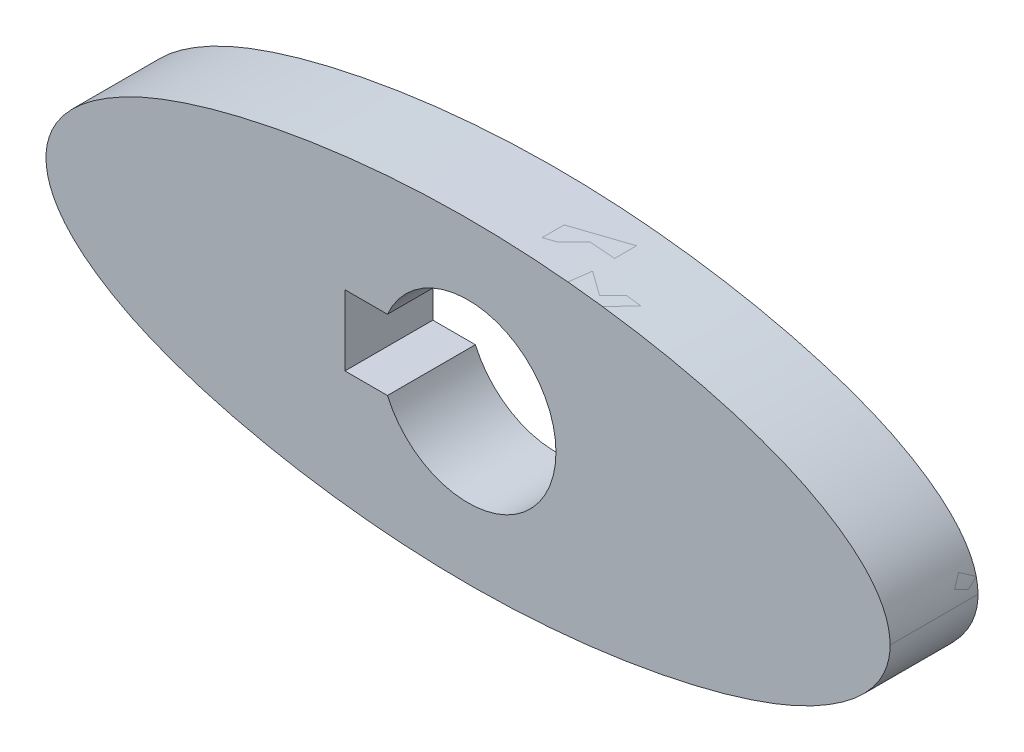
ISO-10303-21;
HEADER;
FILE_DESCRIPTION(('STEP AP214'),'2;1');
FILE_NAME('part.step','',(''),(''),'','','');
FILE_SCHEMA(('AUTOMOTIVE_DESIGN { 1 0 10303 214 1 1 1 1 }'));
ENDSEC;
DATA;
#1=APPLICATION_CONTEXT('core data for automotive mechanical design processes');
#2=APPLICATION_PROTOCOL_DEFINITION('international standard','automotive_design',2000,#1);
#3=PRODUCT_CONTEXT('',#1,'mechanical');
#4=PRODUCT('Part','Part','',(#3));
#5=PRODUCT_RELATED_PRODUCT_CATEGORY('part','',(#4));
#6=PRODUCT_DEFINITION_FORMATION('','',#4);
#7=PRODUCT_DEFINITION_CONTEXT('part definition',#1,'design');
#8=PRODUCT_DEFINITION('design','',#6,#7);
#9=PRODUCT_DEFINITION_SHAPE('','',#8);
#10=(LENGTH_UNIT() NAMED_UNIT(*) SI_UNIT(.MILLI.,.METRE.));
#11=(NAMED_UNIT(*) PLANE_ANGLE_UNIT() SI_UNIT($,.RADIAN.));
#12=(NAMED_UNIT(*) SI_UNIT($,.STERADIAN.) SOLID_ANGLE_UNIT());
#13=UNCERTAINTY_MEASURE_WITH_UNIT(LENGTH_MEASURE(1.E-05),#10,'distance_accuracy_value','');
#14=(GEOMETRIC_REPRESENTATION_CONTEXT(3) GLOBAL_UNCERTAINTY_ASSIGNED_CONTEXT((#13)) GLOBAL_UNIT_ASSIGNED_CONTEXT((#10,
#11,#12)) REPRESENTATION_CONTEXT('',''));
#15=CARTESIAN_POINT('',(0.,0.,0.));
#16=DIRECTION('',(0.,0.,1.));
#17=DIRECTION('',(1.,0.,0.));
#18=AXIS2_PLACEMENT_3D('',#15,#16,#17);
#19=CARTESIAN_POINT('',(29.937276524645,-5.83163265306122,5.));
#20=CARTESIAN_POINT('',(29.9372765246455,-4.33163265306129,5.));
#21=CARTESIAN_POINT('',(28.9772765246454,-2.35163265306127,5.));
#22=CARTESIAN_POINT('',(21.2972765246454,1.48836734693878,5.));
#23=CARTESIAN_POINT('',(13.9372765246452,3.16836734693884,5.));
#24=CARTESIAN_POINT('',(-2.06272347535506,3.16836734693884,5.));
#25=CARTESIAN_POINT('',(-9.42272347535525,1.4883673469388,5.));
#26=CARTESIAN_POINT('',(-17.1027234753555,-2.35163265306127,5.));
#27=CARTESIAN_POINT('',(-18.0627234753554,-4.3316326530613,5.));
#28=CARTESIAN_POINT('',(-18.062723475355,-5.83163265306122,5.));
#29=B_SPLINE_CURVE_WITH_KNOTS('',3,(#19,#20,#21,#22,#23,#24,#25,#26,#27,#28),.UNSPECIFIED.,.F.,
.F.,(4,2,2,2,4),(0.,0.25,0.5,0.75,1.),.UNSPECIFIED.);
#30=DIRECTION('',(0.,0.,-1.));
#31=VECTOR('',#30,1.);
#32=SURFACE_OF_LINEAR_EXTRUSION('',#29,#31);
#33=CARTESIAN_POINT('',(29.937276524645,-5.83163265306122,0.));
#34=CARTESIAN_POINT('',(29.9372765246455,-4.33163265306129,0.));
#35=CARTESIAN_POINT('',(28.9772765246454,-2.35163265306127,0.));
#36=CARTESIAN_POINT('',(21.2972765246454,1.48836734693878,0.));
#37=CARTESIAN_POINT('',(13.9372765246452,3.16836734693884,0.));
#38=CARTESIAN_POINT('',(-2.06272347535506,3.16836734693884,0.));
#39=CARTESIAN_POINT('',(-9.42272347535525,1.4883673469388,0.));
#40=CARTESIAN_POINT('',(-17.1027234753555,-2.35163265306127,0.));
#41=CARTESIAN_POINT('',(-18.0627234753554,-4.3316326530613,0.));
#42=CARTESIAN_POINT('',(-18.062723475355,-5.83163265306122,0.));
#43=B_SPLINE_CURVE_WITH_KNOTS('',3,(#33,#34,#35,#36,#37,#38,#39,#40,#41,#42),.UNSPECIFIED.,.F.,
.F.,(4,2,2,2,4),(0.,0.25,0.5,0.75,1.),.UNSPECIFIED.);
#44=CARTESIAN_POINT('',(29.937276524645,-5.83163265306122,0.));
#45=VERTEX_POINT('',#44);
#46=CARTESIAN_POINT('',(-18.062723475355,-5.83163265306122,0.));
#47=VERTEX_POINT('',#46);
#48=EDGE_CURVE('E54',#45,#47,#43,.T.);
#49=ORIENTED_EDGE('',*,*,#48,.F.);
#50=DIRECTION('',(0.,0.,-1.));
#51=VECTOR('',#50,1.);
#52=CARTESIAN_POINT('',(29.937276524645,-5.83163265306122,5.));
#53=LINE('',#52,#51);
#54=CARTESIAN_POINT('',(29.937276524645,-5.83163265306122,5.));
#55=VERTEX_POINT('',#54);
#56=EDGE_CURVE('E61',#55,#45,#53,.T.);
#57=ORIENTED_EDGE('',*,*,#56,.F.);
#58=CARTESIAN_POINT('',(-18.062723475355,-5.83163265306122,5.));
#59=VERTEX_POINT('',#58);
#60=EDGE_CURVE('E12',#55,#59,#29,.T.);
#61=ORIENTED_EDGE('',*,*,#60,.T.);
#62=DIRECTION('',(0.,0.,-1.));
#63=VECTOR('',#62,1.);
#64=CARTESIAN_POINT('',(-18.062723475355,-5.83163265306122,5.));
#65=LINE('',#64,#63);
#66=EDGE_CURVE('E48',#59,#47,#65,.T.);
#67=ORIENTED_EDGE('',*,*,#66,.T.);
#68=EDGE_LOOP('',(#49,#57,#61,#67));
#69=FACE_BOUND('',#68,.T.);
#70=ADVANCED_FACE('F45',(#69),#32,.T.);
#71=CARTESIAN_POINT('',(-18.062723475355,-5.83163265306122,5.));
#72=CARTESIAN_POINT('',(-18.0627234753554,-7.33163265306135,5.));
#73=CARTESIAN_POINT('',(-17.1027234753554,-9.31163265306139,5.));
#74=CARTESIAN_POINT('',(-9.42272347535519,-13.1516326530615,5.));
#75=CARTESIAN_POINT('',(-2.06272347535508,-14.8316326530615,5.));
#76=CARTESIAN_POINT('',(13.9372765246453,-14.8316326530615,5.));
#77=CARTESIAN_POINT('',(21.2972765246454,-13.1516326530615,5.));
#78=CARTESIAN_POINT('',(28.9772765246455,-9.31163265306142,5.));
#79=CARTESIAN_POINT('',(29.9372765246456,-7.33163265306136,5.));
#80=CARTESIAN_POINT('',(29.937276524645,-5.83163265306122,5.));
#81=B_SPLINE_CURVE_WITH_KNOTS('',3,(#71,#72,#73,#74,#75,#76,#77,#78,#79,#80),.UNSPECIFIED.,.F.,
.F.,(4,2,2,2,4),(0.,0.25,0.5,0.75,1.),.UNSPECIFIED.);
#82=DIRECTION('',(0.,0.,-1.));
#83=VECTOR('',#82,1.);
#84=SURFACE_OF_LINEAR_EXTRUSION('',#81,#83);
#85=CARTESIAN_POINT('',(-18.062723475355,-5.83163265306122,0.));
#86=CARTESIAN_POINT('',(-18.0627234753554,-7.33163265306135,0.));
#87=CARTESIAN_POINT('',(-17.1027234753554,-9.31163265306139,0.));
#88=CARTESIAN_POINT('',(-9.42272347535519,-13.1516326530615,0.));
#89=CARTESIAN_POINT('',(-2.06272347535508,-14.8316326530615,0.));
#90=CARTESIAN_POINT('',(13.9372765246453,-14.8316326530615,0.));
#91=CARTESIAN_POINT('',(21.2972765246454,-13.1516326530615,0.));
#92=CARTESIAN_POINT('',(28.9772765246455,-9.31163265306142,0.));
#93=CARTESIAN_POINT('',(29.9372765246456,-7.33163265306136,0.));
#94=CARTESIAN_POINT('',(29.937276524645,-5.83163265306122,0.));
#95=B_SPLINE_CURVE_WITH_KNOTS('',3,(#85,#86,#87,#88,#89,#90,#91,#92,#93,#94),.UNSPECIFIED.,.F.,
.F.,(4,2,2,2,4),(0.,0.25,0.5,0.75,1.),.UNSPECIFIED.);
#96=EDGE_CURVE('E71',#47,#45,#95,.T.);
#97=ORIENTED_EDGE('',*,*,#96,.F.);
#98=ORIENTED_EDGE('',*,*,#66,.F.);
#99=EDGE_CURVE('E74',#59,#55,#81,.T.);
#100=ORIENTED_EDGE('',*,*,#99,.T.);
#101=ORIENTED_EDGE('',*,*,#56,.T.);
#102=EDGE_LOOP('',(#97,#98,#100,#101));
#103=FACE_BOUND('',#102,.T.);
#104=ADVANCED_FACE('F70',(#103),#84,.T.);
#105=OPEN_SHELL('',(#70,#104));
#106=SHELL_BASED_SURFACE_MODEL('B2',(#105));
#107=CARTESIAN_POINT('',(5.93727652464509,-14.8316326530615,5.));
#108=DIRECTION('',(0.,0.,-1.));
#109=DIRECTION('',(-1.,0.,0.));
#110=AXIS2_PLACEMENT_3D('',#107,#108,#109);
#111=PLANE('',#110);
#112=CARTESIAN_POINT('',(-18.062723475355,-5.83163265306122,5.));
#113=CARTESIAN_POINT('',(-18.0627234753554,-7.33163265306135,5.));
#114=CARTESIAN_POINT('',(-17.1027234753554,-9.31163265306139,5.));
#115=CARTESIAN_POINT('',(-9.42272347535519,-13.1516326530615,5.));
#116=CARTESIAN_POINT('',(-2.06272347535508,-14.8316326530615,5.));
#117=CARTESIAN_POINT('',(13.9372765246453,-14.8316326530615,5.));
#118=CARTESIAN_POINT('',(21.2972765246454,-13.1516326530615,5.));
#119=CARTESIAN_POINT('',(28.9772765246455,-9.31163265306142,5.));
#120=CARTESIAN_POINT('',(29.9372765246456,-7.33163265306136,5.));
#121=CARTESIAN_POINT('',(29.937276524645,-5.83163265306122,5.));
#122=B_SPLINE_CURVE_WITH_KNOTS('',3,(#112,#113,#114,#115,#116,#117,#118,#119,#120,#121),
.UNSPECIFIED.,.F.,.F.,(4,2,2,2,4),(0.,0.25,0.5,0.75,1.),.UNSPECIFIED.);
#123=CARTESIAN_POINT('',(-18.062723475355,-5.83163265306122,5.));
#124=VERTEX_POINT('',#123);
#125=CARTESIAN_POINT('',(29.937276524645,-5.83163265306122,5.));
#126=VERTEX_POINT('',#125);
#127=EDGE_CURVE('E217',#124,#126,#122,.T.);
#128=ORIENTED_EDGE('',*,*,#127,.T.);
#129=CARTESIAN_POINT('',(29.937276524645,-5.83163265306122,5.));
#130=CARTESIAN_POINT('',(29.9372765246455,-4.33163265306129,5.));
#131=CARTESIAN_POINT('',(28.9772765246454,-2.35163265306127,5.));
#132=CARTESIAN_POINT('',(21.2972765246454,1.48836734693878,5.));
#133=CARTESIAN_POINT('',(13.9372765246452,3.16836734693884,5.));
#134=CARTESIAN_POINT('',(-2.06272347535506,3.16836734693884,5.));
#135=CARTESIAN_POINT('',(-9.42272347535525,1.4883673469388,5.));
#136=CARTESIAN_POINT('',(-17.1027234753555,-2.35163265306127,5.));
#137=CARTESIAN_POINT('',(-18.0627234753554,-4.3316326530613,5.));
#138=CARTESIAN_POINT('',(-18.062723475355,-5.83163265306122,5.));
#139=B_SPLINE_CURVE_WITH_KNOTS('',3,(#129,#130,#131,#132,#133,#134,#135,#136,#137,#138),
.UNSPECIFIED.,.F.,.F.,(4,2,2,2,4),(0.,0.25,0.5,0.75,1.),.UNSPECIFIED.);
#140=EDGE_CURVE('E223',#126,#124,#139,.T.);
#141=ORIENTED_EDGE('',*,*,#140,.T.);
#142=EDGE_LOOP('',(#128,#141));
#143=FACE_BOUND('',#142,.T.);
#144=CARTESIAN_POINT('',(5.93727652464496,-5.83163265306122,5.));
#145=DIRECTION('',(0.,0.,1.));
#146=DIRECTION('',(-1.,0.,0.));
#147=AXIS2_PLACEMENT_3D('',#144,#145,#146);
#148=CIRCLE('',#147,5.);
#149=CARTESIAN_POINT('',(1.35470082968912,-7.83163265306122,5.));
#150=VERTEX_POINT('',#149);
#151=CARTESIAN_POINT('',(1.35470082968912,-3.83163265306122,5.));
#152=VERTEX_POINT('',#151);
#153=EDGE_CURVE('E182',#150,#152,#148,.T.);
#154=ORIENTED_EDGE('',*,*,#153,.F.);
#155=DIRECTION('',(1.,0.,0.));
#156=VECTOR('',#155,1.);
#157=CARTESIAN_POINT('',(-1.06272347535504,-7.83163265306122,5.));
#158=LINE('',#157,#156);
#159=CARTESIAN_POINT('',(-1.06272347535504,-7.83163265306122,5.));
#160=VERTEX_POINT('',#159);
#161=EDGE_CURVE('E204',#160,#150,#158,.T.);
#162=ORIENTED_EDGE('',*,*,#161,.F.);
#163=DIRECTION('',(0.,-1.,0.));
#164=VECTOR('',#163,1.);
#165=CARTESIAN_POINT('',(-1.06272347535504,-3.83163265306122,5.));
#166=LINE('',#165,#164);
#167=CARTESIAN_POINT('',(-1.06272347535504,-3.83163265306122,5.));
#168=VERTEX_POINT('',#167);
#169=EDGE_CURVE('E202',#168,#160,#166,.T.);
#170=ORIENTED_EDGE('',*,*,#169,.F.);
#171=DIRECTION('',(-1.,0.,0.));
#172=VECTOR('',#171,1.);
#173=CARTESIAN_POINT('',(-1.06272347535504,-3.83163265306122,5.));
#174=LINE('',#173,#172);
#175=EDGE_CURVE('E190',#152,#168,#174,.T.);
#176=ORIENTED_EDGE('',*,*,#175,.F.);
#177=EDGE_LOOP('',(#154,#162,#170,#176));
#178=FACE_BOUND('',#177,.T.);
#179=ADVANCED_FACE('F128',(#143,#178),#111,.F.);
#180=CARTESIAN_POINT('',(5.93727652464509,-14.8316326530615,0.));
#181=DIRECTION('',(0.,0.,-1.));
#182=DIRECTION('',(-1.,0.,0.));
#183=AXIS2_PLACEMENT_3D('',#180,#181,#182);
#184=PLANE('',#183);
#185=CARTESIAN_POINT('',(-18.062723475355,-5.83163265306122,0.));
#186=CARTESIAN_POINT('',(-18.0627234753554,-7.33163265306135,0.));
#187=CARTESIAN_POINT('',(-17.1027234753554,-9.31163265306139,0.));
#188=CARTESIAN_POINT('',(-9.42272347535519,-13.1516326530615,0.));
#189=CARTESIAN_POINT('',(-2.06272347535508,-14.8316326530615,0.));
#190=CARTESIAN_POINT('',(13.9372765246453,-14.8316326530615,0.));
#191=CARTESIAN_POINT('',(21.2972765246454,-13.1516326530615,0.));
#192=CARTESIAN_POINT('',(28.9772765246455,-9.31163265306142,0.));
#193=CARTESIAN_POINT('',(29.9372765246456,-7.33163265306136,0.));
#194=CARTESIAN_POINT('',(29.937276524645,-5.83163265306122,0.));
#195=B_SPLINE_CURVE_WITH_KNOTS('',3,(#185,#186,#187,#188,#189,#190,#191,#192,#193,#194),
.UNSPECIFIED.,.F.,.F.,(4,2,2,2,4),(0.,0.25,0.5,0.75,1.),.UNSPECIFIED.);
#196=CARTESIAN_POINT('',(-18.062723475355,-5.83163265306122,0.));
#197=VERTEX_POINT('',#196);
#198=CARTESIAN_POINT('',(29.937276524645,-5.83163265306122,0.));
#199=VERTEX_POINT('',#198);
#200=EDGE_CURVE('E198',#197,#199,#195,.T.);
#201=ORIENTED_EDGE('',*,*,#200,.F.);
#202=CARTESIAN_POINT('',(29.937276524645,-5.83163265306122,0.));
#203=CARTESIAN_POINT('',(29.9372765246455,-4.33163265306129,0.));
#204=CARTESIAN_POINT('',(28.9772765246454,-2.35163265306127,0.));
#205=CARTESIAN_POINT('',(21.2972765246454,1.48836734693878,0.));
#206=CARTESIAN_POINT('',(13.9372765246452,3.16836734693884,0.));
#207=CARTESIAN_POINT('',(-2.06272347535506,3.16836734693884,0.));
#208=CARTESIAN_POINT('',(-9.42272347535525,1.4883673469388,0.));
#209=CARTESIAN_POINT('',(-17.1027234753555,-2.35163265306127,0.));
#210=CARTESIAN_POINT('',(-18.0627234753554,-4.3316326530613,0.));
#211=CARTESIAN_POINT('',(-18.062723475355,-5.83163265306122,0.));
#212=B_SPLINE_CURVE_WITH_KNOTS('',3,(#202,#203,#204,#205,#206,#207,#208,#209,#210,#211),
.UNSPECIFIED.,.F.,.F.,(4,2,2,2,4),(0.,0.25,0.5,0.75,1.),.UNSPECIFIED.);
#213=EDGE_CURVE('E224',#199,#197,#212,.T.);
#214=ORIENTED_EDGE('',*,*,#213,.F.);
#215=EDGE_LOOP('',(#201,#214));
#216=FACE_BOUND('',#215,.T.);
#217=DIRECTION('',(1.,0.,0.));
#218=VECTOR('',#217,1.);
#219=CARTESIAN_POINT('',(-1.06272347535504,-7.83163265306122,0.));
#220=LINE('',#219,#218);
#221=CARTESIAN_POINT('',(-1.06272347535504,-7.83163265306122,0.));
#222=VERTEX_POINT('',#221);
#223=CARTESIAN_POINT('',(1.35470082968912,-7.83163265306122,0.));
#224=VERTEX_POINT('',#223);
#225=EDGE_CURVE('E191',#222,#224,#220,.T.);
#226=ORIENTED_EDGE('',*,*,#225,.T.);
#227=CARTESIAN_POINT('',(5.93727652464496,-5.83163265306122,0.));
#228=DIRECTION('',(0.,0.,1.));
#229=DIRECTION('',(-1.,0.,0.));
#230=AXIS2_PLACEMENT_3D('',#227,#228,#229);
#231=CIRCLE('',#230,5.);
#232=CARTESIAN_POINT('',(1.35470082968912,-3.83163265306122,0.));
#233=VERTEX_POINT('',#232);
#234=EDGE_CURVE('E152',#224,#233,#231,.T.);
#235=ORIENTED_EDGE('',*,*,#234,.T.);
#236=DIRECTION('',(-1.,0.,0.));
#237=VECTOR('',#236,1.);
#238=CARTESIAN_POINT('',(-1.06272347535504,-3.83163265306122,0.));
#239=LINE('',#238,#237);
#240=CARTESIAN_POINT('',(-1.06272347535504,-3.83163265306122,0.));
#241=VERTEX_POINT('',#240);
#242=EDGE_CURVE('E197',#233,#241,#239,.T.);
#243=ORIENTED_EDGE('',*,*,#242,.T.);
#244=DIRECTION('',(0.,-1.,0.));
#245=VECTOR('',#244,1.);
#246=CARTESIAN_POINT('',(-1.06272347535504,-3.83163265306122,0.));
#247=LINE('',#246,#245);
#248=EDGE_CURVE('E210',#241,#222,#247,.T.);
#249=ORIENTED_EDGE('',*,*,#248,.T.);
#250=EDGE_LOOP('',(#226,#235,#243,#249));
#251=FACE_BOUND('',#250,.T.);
#252=ADVANCED_FACE('F242',(#216,#251),#184,.T.);
#253=DIRECTION('',(0.,0.,-1.));
#254=VECTOR('',#253,1.);
#255=SURFACE_OF_LINEAR_EXTRUSION('',#122,#254);
#256=ORIENTED_EDGE('',*,*,#200,.T.);
#257=DIRECTION('',(0.,0.,-1.));
#258=VECTOR('',#257,1.);
#259=CARTESIAN_POINT('',(29.937276524645,-5.83163265306122,5.));
#260=LINE('',#259,#258);
#261=EDGE_CURVE('E43',#126,#199,#260,.T.);
#262=ORIENTED_EDGE('',*,*,#261,.F.);
#263=ORIENTED_EDGE('',*,*,#127,.F.);
#264=DIRECTION('',(0.,0.,-1.));
#265=VECTOR('',#264,1.);
#266=CARTESIAN_POINT('',(-18.062723475355,-5.83163265306122,5.));
#267=LINE('',#266,#265);
#268=EDGE_CURVE('E137',#124,#197,#267,.T.);
#269=ORIENTED_EDGE('',*,*,#268,.T.);
#270=EDGE_LOOP('',(#256,#262,#263,#269));
#271=FACE_BOUND('',#270,.T.);
#272=ADVANCED_FACE('F130',(#271),#255,.F.);
#273=DIRECTION('',(0.,0.,-1.));
#274=VECTOR('',#273,1.);
#275=SURFACE_OF_LINEAR_EXTRUSION('',#139,#274);
#276=ORIENTED_EDGE('',*,*,#213,.T.);
#277=ORIENTED_EDGE('',*,*,#268,.F.);
#278=ORIENTED_EDGE('',*,*,#140,.F.);
#279=ORIENTED_EDGE('',*,*,#261,.T.);
#280=EDGE_LOOP('',(#276,#277,#278,#279));
#281=FACE_BOUND('',#280,.T.);
#282=ADVANCED_FACE('F238',(#281),#275,.F.);
#283=CARTESIAN_POINT('',(5.93727652464496,-5.83163265306122,5.));
#284=DIRECTION('',(0.,0.,-1.));
#285=DIRECTION('',(-1.,0.,0.));
#286=AXIS2_PLACEMENT_3D('',#283,#284,#285);
#287=CYLINDRICAL_SURFACE('',#286,5.);
#288=ORIENTED_EDGE('',*,*,#234,.F.);
#289=DIRECTION('',(0.,0.,-1.));
#290=VECTOR('',#289,1.);
#291=CARTESIAN_POINT('',(1.35470082968912,-7.83163265306122,5.));
#292=LINE('',#291,#290);
#293=EDGE_CURVE('E186',#150,#224,#292,.T.);
#294=ORIENTED_EDGE('',*,*,#293,.F.);
#295=ORIENTED_EDGE('',*,*,#153,.T.);
#296=DIRECTION('',(0.,0.,-1.));
#297=VECTOR('',#296,1.);
#298=CARTESIAN_POINT('',(1.35470082968912,-3.83163265306122,5.));
#299=LINE('',#298,#297);
#300=EDGE_CURVE('E185',#152,#233,#299,.T.);
#301=ORIENTED_EDGE('',*,*,#300,.T.);
#302=EDGE_LOOP('',(#288,#294,#295,#301));
#303=FACE_BOUND('',#302,.T.);
#304=ADVANCED_FACE('F184',(#303),#287,.F.);
#305=CARTESIAN_POINT('',(-1.06272347535504,-3.83163265306122,5.));
#306=DIRECTION('',(0.,-1.,0.));
#307=DIRECTION('',(0.,0.,-1.));
#308=AXIS2_PLACEMENT_3D('',#305,#306,#307);
#309=PLANE('',#308);
#310=ORIENTED_EDGE('',*,*,#242,.F.);
#311=ORIENTED_EDGE('',*,*,#300,.F.);
#312=ORIENTED_EDGE('',*,*,#175,.T.);
#313=DIRECTION('',(0.,0.,-1.));
#314=VECTOR('',#313,1.);
#315=CARTESIAN_POINT('',(-1.06272347535504,-3.83163265306122,5.));
#316=LINE('',#315,#314);
#317=EDGE_CURVE('E199',#168,#241,#316,.T.);
#318=ORIENTED_EDGE('',*,*,#317,.T.);
#319=EDGE_LOOP('',(#310,#311,#312,#318));
#320=FACE_BOUND('',#319,.T.);
#321=ADVANCED_FACE('F194',(#320),#309,.T.);
#322=CARTESIAN_POINT('',(-1.06272347535504,-3.83163265306122,5.));
#323=DIRECTION('',(1.,0.,0.));
#324=DIRECTION('',(0.,0.,-1.));
#325=AXIS2_PLACEMENT_3D('',#322,#323,#324);
#326=PLANE('',#325);
#327=ORIENTED_EDGE('',*,*,#248,.F.);
#328=ORIENTED_EDGE('',*,*,#317,.F.);
#329=ORIENTED_EDGE('',*,*,#169,.T.);
#330=DIRECTION('',(0.,0.,-1.));
#331=VECTOR('',#330,1.);
#332=CARTESIAN_POINT('',(-1.06272347535504,-7.83163265306122,5.));
#333=LINE('',#332,#331);
#334=EDGE_CURVE('E144',#160,#222,#333,.T.);
#335=ORIENTED_EDGE('',*,*,#334,.T.);
#336=EDGE_LOOP('',(#327,#328,#329,#335));
#337=FACE_BOUND('',#336,.T.);
#338=ADVANCED_FACE('F253',(#337),#326,.T.);
#339=CARTESIAN_POINT('',(-1.06272347535504,-7.83163265306122,5.));
#340=DIRECTION('',(0.,1.,0.));
#341=DIRECTION('',(0.,0.,1.));
#342=AXIS2_PLACEMENT_3D('',#339,#340,#341);
#343=PLANE('',#342);
#344=ORIENTED_EDGE('',*,*,#225,.F.);
#345=ORIENTED_EDGE('',*,*,#334,.F.);
#346=ORIENTED_EDGE('',*,*,#161,.T.);
#347=ORIENTED_EDGE('',*,*,#293,.T.);
#348=EDGE_LOOP('',(#344,#345,#346,#347));
#349=FACE_BOUND('',#348,.T.);
#350=ADVANCED_FACE('F256',(#349),#343,.T.);
#351=CLOSED_SHELL('',(#179,#252,#272,#282,#304,#321,#338,#350));
#352=MANIFOLD_SOLID_BREP('B6',#351);
#353=ADVANCED_BREP_SHAPE_REPRESENTATION('',(#18,#352),#14);
#354=MANIFOLD_SURFACE_SHAPE_REPRESENTATION('',(#18,#106),#14);
#355=SHAPE_REPRESENTATION('',(#18),#14);
#356=SHAPE_DEFINITION_REPRESENTATION(#9,#355);
#357=SHAPE_REPRESENTATION_RELATIONSHIP('','',#355,#353);
#358=SHAPE_REPRESENTATION_RELATIONSHIP('','',#355,#354);
ENDSEC;
END-ISO-10303-21;
